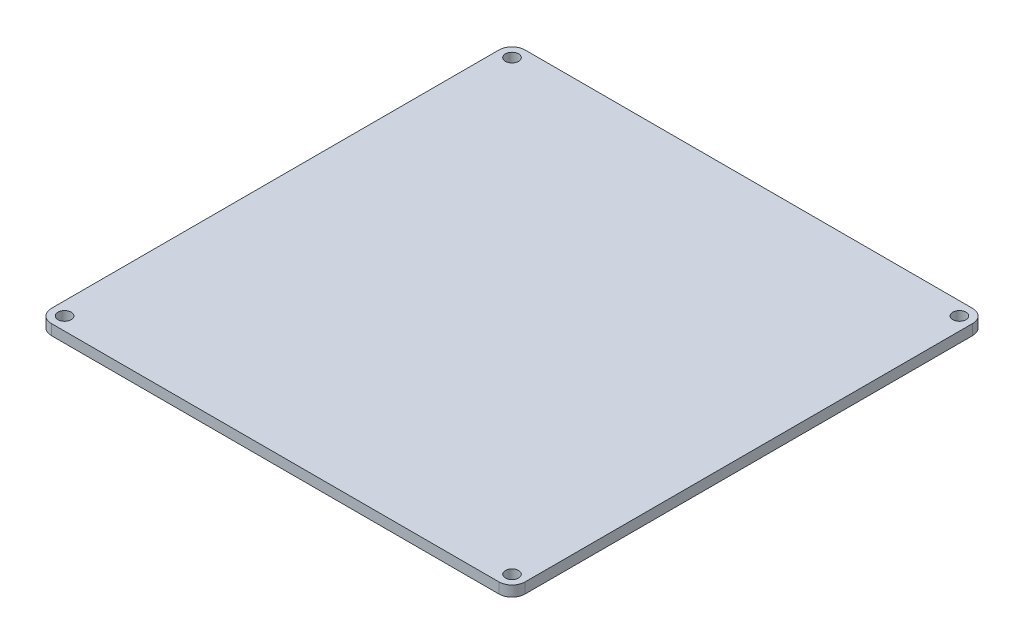
ISO-10303-21;
HEADER;
FILE_DESCRIPTION(('STEP AP214'),'2;1');
FILE_NAME('part.step','',(''),(''),'','','');
FILE_SCHEMA(('AUTOMOTIVE_DESIGN { 1 0 10303 214 1 1 1 1 }'));
ENDSEC;
DATA;
#1=APPLICATION_CONTEXT('core data for automotive mechanical design processes');
#2=APPLICATION_PROTOCOL_DEFINITION('international standard','automotive_design',2000,#1);
#3=PRODUCT_CONTEXT('',#1,'mechanical');
#4=PRODUCT('Part','Part','',(#3));
#5=PRODUCT_RELATED_PRODUCT_CATEGORY('part','',(#4));
#6=PRODUCT_DEFINITION_FORMATION('','',#4);
#7=PRODUCT_DEFINITION_CONTEXT('part definition',#1,'design');
#8=PRODUCT_DEFINITION('design','',#6,#7);
#9=PRODUCT_DEFINITION_SHAPE('','',#8);
#10=(LENGTH_UNIT() NAMED_UNIT(*) SI_UNIT(.MILLI.,.METRE.));
#11=(NAMED_UNIT(*) PLANE_ANGLE_UNIT() SI_UNIT($,.RADIAN.));
#12=(NAMED_UNIT(*) SI_UNIT($,.STERADIAN.) SOLID_ANGLE_UNIT());
#13=UNCERTAINTY_MEASURE_WITH_UNIT(LENGTH_MEASURE(1.E-05),#10,'distance_accuracy_value','');
#14=(GEOMETRIC_REPRESENTATION_CONTEXT(3) GLOBAL_UNCERTAINTY_ASSIGNED_CONTEXT((#13)) GLOBAL_UNIT_ASSIGNED_CONTEXT((#10,
#11,#12)) REPRESENTATION_CONTEXT('',''));
#15=CARTESIAN_POINT('',(0.,0.,0.));
#16=DIRECTION('',(0.,0.,1.));
#17=DIRECTION('',(1.,0.,0.));
#18=AXIS2_PLACEMENT_3D('',#15,#16,#17);
#19=CARTESIAN_POINT('',(0.,4.,0.));
#20=DIRECTION('',(0.,-1.,0.));
#21=DIRECTION('',(0.,0.,-1.));
#22=AXIS2_PLACEMENT_3D('',#19,#20,#21);
#23=PLANE('',#22);
#24=DIRECTION('',(-1.,0.,0.));
#25=VECTOR('',#24,1.);
#26=CARTESIAN_POINT('',(0.,4.,-180.));
#27=LINE('',#26,#25);
#28=CARTESIAN_POINT('',(175.,4.,-180.));
#29=VERTEX_POINT('',#28);
#30=CARTESIAN_POINT('',(5.,4.,-180.));
#31=VERTEX_POINT('',#30);
#32=EDGE_CURVE('E136',#29,#31,#27,.T.);
#33=ORIENTED_EDGE('',*,*,#32,.T.);
#34=CARTESIAN_POINT('',(5.,4.,-175.));
#35=DIRECTION('',(0.,-1.,0.));
#36=DIRECTION('',(0.,0.,-1.));
#37=AXIS2_PLACEMENT_3D('',#34,#35,#36);
#38=CIRCLE('',#37,5.);
#39=CARTESIAN_POINT('',(0.,4.,-175.));
#40=VERTEX_POINT('',#39);
#41=EDGE_CURVE('E155',#31,#40,#38,.F.);
#42=ORIENTED_EDGE('',*,*,#41,.T.);
#43=DIRECTION('',(0.,0.,1.));
#44=VECTOR('',#43,1.);
#45=CARTESIAN_POINT('',(0.,4.,0.));
#46=LINE('',#45,#44);
#47=CARTESIAN_POINT('',(0.,4.,-5.));
#48=VERTEX_POINT('',#47);
#49=EDGE_CURVE('E119',#40,#48,#46,.T.);
#50=ORIENTED_EDGE('',*,*,#49,.T.);
#51=CARTESIAN_POINT('',(5.,4.,-5.));
#52=DIRECTION('',(0.,-1.,0.));
#53=DIRECTION('',(0.,0.,-1.));
#54=AXIS2_PLACEMENT_3D('',#51,#52,#53);
#55=CIRCLE('',#54,5.);
#56=CARTESIAN_POINT('',(5.,4.,0.));
#57=VERTEX_POINT('',#56);
#58=EDGE_CURVE('E150',#48,#57,#55,.F.);
#59=ORIENTED_EDGE('',*,*,#58,.T.);
#60=DIRECTION('',(1.,0.,0.));
#61=VECTOR('',#60,1.);
#62=CARTESIAN_POINT('',(0.,4.,0.));
#63=LINE('',#62,#61);
#64=CARTESIAN_POINT('',(175.,4.,0.));
#65=VERTEX_POINT('',#64);
#66=EDGE_CURVE('E166',#57,#65,#63,.T.);
#67=ORIENTED_EDGE('',*,*,#66,.T.);
#68=CARTESIAN_POINT('',(175.,4.,-5.));
#69=DIRECTION('',(0.,-1.,0.));
#70=DIRECTION('',(0.,0.,-1.));
#71=AXIS2_PLACEMENT_3D('',#68,#69,#70);
#72=CIRCLE('',#71,5.);
#73=CARTESIAN_POINT('',(180.,4.,-5.));
#74=VERTEX_POINT('',#73);
#75=EDGE_CURVE('E55',#65,#74,#72,.F.);
#76=ORIENTED_EDGE('',*,*,#75,.T.);
#77=DIRECTION('',(0.,0.,-1.));
#78=VECTOR('',#77,1.);
#79=CARTESIAN_POINT('',(180.,4.,0.));
#80=LINE('',#79,#78);
#81=CARTESIAN_POINT('',(180.,4.,-175.));
#82=VERTEX_POINT('',#81);
#83=EDGE_CURVE('E174',#74,#82,#80,.T.);
#84=ORIENTED_EDGE('',*,*,#83,.T.);
#85=CARTESIAN_POINT('',(175.,4.,-175.));
#86=DIRECTION('',(0.,-1.,0.));
#87=DIRECTION('',(0.,0.,-1.));
#88=AXIS2_PLACEMENT_3D('',#85,#86,#87);
#89=CIRCLE('',#88,5.);
#90=EDGE_CURVE('E153',#82,#29,#89,.F.);
#91=ORIENTED_EDGE('',*,*,#90,.T.);
#92=EDGE_LOOP('',(#33,#42,#50,#59,#67,#76,#84,#91));
#93=FACE_BOUND('',#92,.T.);
#94=CARTESIAN_POINT('',(4.99999999999999,4.,-175.));
#95=DIRECTION('',(0.,1.,0.));
#96=DIRECTION('',(0.,0.,1.));
#97=AXIS2_PLACEMENT_3D('',#94,#95,#96);
#98=CIRCLE('',#97,2.5);
#99=CARTESIAN_POINT('',(4.99999999999999,4.,-172.5));
#100=VERTEX_POINT('',#99);
#101=EDGE_CURVE('E127',#100,#100,#98,.T.);
#102=ORIENTED_EDGE('',*,*,#101,.F.);
#103=EDGE_LOOP('',(#102));
#104=FACE_BOUND('',#103,.T.);
#105=CARTESIAN_POINT('',(175.,4.,-4.99999999999999));
#106=DIRECTION('',(0.,1.,0.));
#107=DIRECTION('',(0.,0.,1.));
#108=AXIS2_PLACEMENT_3D('',#105,#106,#107);
#109=CIRCLE('',#108,2.5);
#110=CARTESIAN_POINT('',(175.,4.,-2.5));
#111=VERTEX_POINT('',#110);
#112=EDGE_CURVE('E181',#111,#111,#109,.T.);
#113=ORIENTED_EDGE('',*,*,#112,.F.);
#114=EDGE_LOOP('',(#113));
#115=FACE_BOUND('',#114,.T.);
#116=CARTESIAN_POINT('',(175.,4.,-175.));
#117=DIRECTION('',(0.,1.,0.));
#118=DIRECTION('',(0.,0.,1.));
#119=AXIS2_PLACEMENT_3D('',#116,#117,#118);
#120=CIRCLE('',#119,2.5);
#121=CARTESIAN_POINT('',(175.,4.,-172.5));
#122=VERTEX_POINT('',#121);
#123=EDGE_CURVE('E186',#122,#122,#120,.T.);
#124=ORIENTED_EDGE('',*,*,#123,.F.);
#125=EDGE_LOOP('',(#124));
#126=FACE_BOUND('',#125,.T.);
#127=CARTESIAN_POINT('',(4.99999999999999,4.,-4.99999999999999));
#128=DIRECTION('',(0.,1.,0.));
#129=DIRECTION('',(0.,0.,1.));
#130=AXIS2_PLACEMENT_3D('',#127,#128,#129);
#131=CIRCLE('',#130,2.5);
#132=CARTESIAN_POINT('',(4.99999999999999,4.,-2.49999999999999));
#133=VERTEX_POINT('',#132);
#134=EDGE_CURVE('E192',#133,#133,#131,.T.);
#135=ORIENTED_EDGE('',*,*,#134,.F.);
#136=EDGE_LOOP('',(#135));
#137=FACE_BOUND('',#136,.T.);
#138=ADVANCED_FACE('F33',(#93,#104,#115,#126,#137),#23,.F.);
#139=CARTESIAN_POINT('',(0.,0.,0.));
#140=DIRECTION('',(0.,-1.,0.));
#141=DIRECTION('',(0.,0.,-1.));
#142=AXIS2_PLACEMENT_3D('',#139,#140,#141);
#143=PLANE('',#142);
#144=CARTESIAN_POINT('',(175.,0.,-175.));
#145=DIRECTION('',(0.,1.,0.));
#146=DIRECTION('',(0.,0.,1.));
#147=AXIS2_PLACEMENT_3D('',#144,#145,#146);
#148=CIRCLE('',#147,2.5);
#149=CARTESIAN_POINT('',(175.,0.,-172.5));
#150=VERTEX_POINT('',#149);
#151=EDGE_CURVE('E189',#150,#150,#148,.T.);
#152=ORIENTED_EDGE('',*,*,#151,.T.);
#153=EDGE_LOOP('',(#152));
#154=FACE_BOUND('',#153,.T.);
#155=CARTESIAN_POINT('',(4.99999999999999,0.,-175.));
#156=DIRECTION('',(0.,1.,0.));
#157=DIRECTION('',(0.,0.,1.));
#158=AXIS2_PLACEMENT_3D('',#155,#156,#157);
#159=CIRCLE('',#158,2.5);
#160=CARTESIAN_POINT('',(4.99999999999999,0.,-172.5));
#161=VERTEX_POINT('',#160);
#162=EDGE_CURVE('E133',#161,#161,#159,.T.);
#163=ORIENTED_EDGE('',*,*,#162,.T.);
#164=EDGE_LOOP('',(#163));
#165=FACE_BOUND('',#164,.T.);
#166=DIRECTION('',(0.,0.,1.));
#167=VECTOR('',#166,1.);
#168=CARTESIAN_POINT('',(0.,0.,0.));
#169=LINE('',#168,#167);
#170=CARTESIAN_POINT('',(0.,0.,-175.));
#171=VERTEX_POINT('',#170);
#172=CARTESIAN_POINT('',(0.,0.,-5.));
#173=VERTEX_POINT('',#172);
#174=EDGE_CURVE('E116',#171,#173,#169,.T.);
#175=ORIENTED_EDGE('',*,*,#174,.F.);
#176=CARTESIAN_POINT('',(5.,0.,-175.));
#177=DIRECTION('',(0.,-1.,0.));
#178=DIRECTION('',(0.,0.,-1.));
#179=AXIS2_PLACEMENT_3D('',#176,#177,#178);
#180=CIRCLE('',#179,5.);
#181=CARTESIAN_POINT('',(5.,0.,-180.));
#182=VERTEX_POINT('',#181);
#183=EDGE_CURVE('E99',#171,#182,#180,.T.);
#184=ORIENTED_EDGE('',*,*,#183,.T.);
#185=DIRECTION('',(-1.,0.,0.));
#186=VECTOR('',#185,1.);
#187=CARTESIAN_POINT('',(0.,0.,-180.));
#188=LINE('',#187,#186);
#189=CARTESIAN_POINT('',(175.,0.,-180.));
#190=VERTEX_POINT('',#189);
#191=EDGE_CURVE('E140',#190,#182,#188,.T.);
#192=ORIENTED_EDGE('',*,*,#191,.F.);
#193=CARTESIAN_POINT('',(175.,0.,-175.));
#194=DIRECTION('',(0.,-1.,0.));
#195=DIRECTION('',(0.,0.,-1.));
#196=AXIS2_PLACEMENT_3D('',#193,#194,#195);
#197=CIRCLE('',#196,5.);
#198=CARTESIAN_POINT('',(180.,0.,-175.));
#199=VERTEX_POINT('',#198);
#200=EDGE_CURVE('E110',#190,#199,#197,.T.);
#201=ORIENTED_EDGE('',*,*,#200,.T.);
#202=DIRECTION('',(0.,0.,-1.));
#203=VECTOR('',#202,1.);
#204=CARTESIAN_POINT('',(180.,0.,0.));
#205=LINE('',#204,#203);
#206=CARTESIAN_POINT('',(180.,0.,-5.));
#207=VERTEX_POINT('',#206);
#208=EDGE_CURVE('E130',#207,#199,#205,.T.);
#209=ORIENTED_EDGE('',*,*,#208,.F.);
#210=CARTESIAN_POINT('',(175.,0.,-5.));
#211=DIRECTION('',(0.,-1.,0.));
#212=DIRECTION('',(0.,0.,-1.));
#213=AXIS2_PLACEMENT_3D('',#210,#211,#212);
#214=CIRCLE('',#213,5.);
#215=CARTESIAN_POINT('',(175.,0.,0.));
#216=VERTEX_POINT('',#215);
#217=EDGE_CURVE('E144',#207,#216,#214,.T.);
#218=ORIENTED_EDGE('',*,*,#217,.T.);
#219=DIRECTION('',(1.,0.,0.));
#220=VECTOR('',#219,1.);
#221=CARTESIAN_POINT('',(0.,0.,0.));
#222=LINE('',#221,#220);
#223=CARTESIAN_POINT('',(5.,0.,0.));
#224=VERTEX_POINT('',#223);
#225=EDGE_CURVE('E126',#224,#216,#222,.T.);
#226=ORIENTED_EDGE('',*,*,#225,.F.);
#227=CARTESIAN_POINT('',(5.,0.,-5.));
#228=DIRECTION('',(0.,-1.,0.));
#229=DIRECTION('',(0.,0.,-1.));
#230=AXIS2_PLACEMENT_3D('',#227,#228,#229);
#231=CIRCLE('',#230,5.);
#232=EDGE_CURVE('E120',#224,#173,#231,.T.);
#233=ORIENTED_EDGE('',*,*,#232,.T.);
#234=EDGE_LOOP('',(#175,#184,#192,#201,#209,#218,#226,#233));
#235=FACE_BOUND('',#234,.T.);
#236=CARTESIAN_POINT('',(175.,0.,-4.99999999999999));
#237=DIRECTION('',(0.,1.,0.));
#238=DIRECTION('',(0.,0.,1.));
#239=AXIS2_PLACEMENT_3D('',#236,#237,#238);
#240=CIRCLE('',#239,2.5);
#241=CARTESIAN_POINT('',(175.,0.,-2.5));
#242=VERTEX_POINT('',#241);
#243=EDGE_CURVE('E183',#242,#242,#240,.T.);
#244=ORIENTED_EDGE('',*,*,#243,.T.);
#245=EDGE_LOOP('',(#244));
#246=FACE_BOUND('',#245,.T.);
#247=CARTESIAN_POINT('',(4.99999999999999,0.,-4.99999999999999));
#248=DIRECTION('',(0.,1.,0.));
#249=DIRECTION('',(0.,0.,1.));
#250=AXIS2_PLACEMENT_3D('',#247,#248,#249);
#251=CIRCLE('',#250,2.5);
#252=CARTESIAN_POINT('',(4.99999999999999,0.,-2.49999999999999));
#253=VERTEX_POINT('',#252);
#254=EDGE_CURVE('E195',#253,#253,#251,.T.);
#255=ORIENTED_EDGE('',*,*,#254,.T.);
#256=EDGE_LOOP('',(#255));
#257=FACE_BOUND('',#256,.T.);
#258=ADVANCED_FACE('F123',(#154,#165,#235,#246,#257),#143,.T.);
#259=CARTESIAN_POINT('',(0.,4.,0.));
#260=DIRECTION('',(1.,0.,0.));
#261=DIRECTION('',(0.,0.,-1.));
#262=AXIS2_PLACEMENT_3D('',#259,#260,#261);
#263=PLANE('',#262);
#264=ORIENTED_EDGE('',*,*,#49,.F.);
#265=DIRECTION('',(0.,-1.,0.));
#266=VECTOR('',#265,1.);
#267=CARTESIAN_POINT('',(0.,4.,-175.));
#268=LINE('',#267,#266);
#269=EDGE_CURVE('E103',#40,#171,#268,.T.);
#270=ORIENTED_EDGE('',*,*,#269,.T.);
#271=ORIENTED_EDGE('',*,*,#174,.T.);
#272=DIRECTION('',(0.,-1.,0.));
#273=VECTOR('',#272,1.);
#274=CARTESIAN_POINT('',(0.,4.,-5.));
#275=LINE('',#274,#273);
#276=EDGE_CURVE('E121',#173,#48,#275,.F.);
#277=ORIENTED_EDGE('',*,*,#276,.T.);
#278=EDGE_LOOP('',(#264,#270,#271,#277));
#279=FACE_BOUND('',#278,.T.);
#280=ADVANCED_FACE('F115',(#279),#263,.F.);
#281=CARTESIAN_POINT('',(0.,4.,0.));
#282=DIRECTION('',(0.,0.,-1.));
#283=DIRECTION('',(-1.,0.,0.));
#284=AXIS2_PLACEMENT_3D('',#281,#282,#283);
#285=PLANE('',#284);
#286=ORIENTED_EDGE('',*,*,#225,.T.);
#287=DIRECTION('',(0.,-1.,0.));
#288=VECTOR('',#287,1.);
#289=CARTESIAN_POINT('',(175.,4.,0.));
#290=LINE('',#289,#288);
#291=EDGE_CURVE('E11',#216,#65,#290,.F.);
#292=ORIENTED_EDGE('',*,*,#291,.T.);
#293=ORIENTED_EDGE('',*,*,#66,.F.);
#294=DIRECTION('',(0.,-1.,0.));
#295=VECTOR('',#294,1.);
#296=CARTESIAN_POINT('',(5.,4.,0.));
#297=LINE('',#296,#295);
#298=EDGE_CURVE('E41',#57,#224,#297,.T.);
#299=ORIENTED_EDGE('',*,*,#298,.T.);
#300=EDGE_LOOP('',(#286,#292,#293,#299));
#301=FACE_BOUND('',#300,.T.);
#302=ADVANCED_FACE('F164',(#301),#285,.F.);
#303=CARTESIAN_POINT('',(180.,4.,0.));
#304=DIRECTION('',(-1.,0.,0.));
#305=DIRECTION('',(0.,0.,1.));
#306=AXIS2_PLACEMENT_3D('',#303,#304,#305);
#307=PLANE('',#306);
#308=ORIENTED_EDGE('',*,*,#208,.T.);
#309=DIRECTION('',(0.,-1.,0.));
#310=VECTOR('',#309,1.);
#311=CARTESIAN_POINT('',(180.,4.,-175.));
#312=LINE('',#311,#310);
#313=EDGE_CURVE('E48',#199,#82,#312,.F.);
#314=ORIENTED_EDGE('',*,*,#313,.T.);
#315=ORIENTED_EDGE('',*,*,#83,.F.);
#316=DIRECTION('',(0.,-1.,0.));
#317=VECTOR('',#316,1.);
#318=CARTESIAN_POINT('',(180.,4.,-5.));
#319=LINE('',#318,#317);
#320=EDGE_CURVE('E157',#74,#207,#319,.T.);
#321=ORIENTED_EDGE('',*,*,#320,.T.);
#322=EDGE_LOOP('',(#308,#314,#315,#321));
#323=FACE_BOUND('',#322,.T.);
#324=ADVANCED_FACE('F173',(#323),#307,.F.);
#325=CARTESIAN_POINT('',(0.,4.,-180.));
#326=DIRECTION('',(0.,0.,1.));
#327=DIRECTION('',(1.,0.,0.));
#328=AXIS2_PLACEMENT_3D('',#325,#326,#327);
#329=PLANE('',#328);
#330=ORIENTED_EDGE('',*,*,#191,.T.);
#331=DIRECTION('',(0.,-1.,0.));
#332=VECTOR('',#331,1.);
#333=CARTESIAN_POINT('',(5.,4.,-180.));
#334=LINE('',#333,#332);
#335=EDGE_CURVE('E104',#182,#31,#334,.F.);
#336=ORIENTED_EDGE('',*,*,#335,.T.);
#337=ORIENTED_EDGE('',*,*,#32,.F.);
#338=DIRECTION('',(0.,-1.,0.));
#339=VECTOR('',#338,1.);
#340=CARTESIAN_POINT('',(175.,4.,-180.));
#341=LINE('',#340,#339);
#342=EDGE_CURVE('E109',#29,#190,#341,.T.);
#343=ORIENTED_EDGE('',*,*,#342,.T.);
#344=EDGE_LOOP('',(#330,#336,#337,#343));
#345=FACE_BOUND('',#344,.T.);
#346=ADVANCED_FACE('F216',(#345),#329,.F.);
#347=CARTESIAN_POINT('',(4.99999999999999,4.,-175.));
#348=DIRECTION('',(0.,-1.,0.));
#349=DIRECTION('',(0.,0.,-1.));
#350=AXIS2_PLACEMENT_3D('',#347,#348,#349);
#351=CYLINDRICAL_SURFACE('',#350,2.5);
#352=ORIENTED_EDGE('',*,*,#101,.T.);
#353=EDGE_LOOP('',(#352));
#354=FACE_BOUND('',#353,.T.);
#355=ORIENTED_EDGE('',*,*,#162,.F.);
#356=EDGE_LOOP('',(#355));
#357=FACE_BOUND('',#356,.T.);
#358=ADVANCED_FACE('F213',(#354,#357),#351,.F.);
#359=CARTESIAN_POINT('',(175.,4.,-4.99999999999999));
#360=DIRECTION('',(0.,-1.,0.));
#361=DIRECTION('',(0.,0.,-1.));
#362=AXIS2_PLACEMENT_3D('',#359,#360,#361);
#363=CYLINDRICAL_SURFACE('',#362,2.5);
#364=ORIENTED_EDGE('',*,*,#112,.T.);
#365=EDGE_LOOP('',(#364));
#366=FACE_BOUND('',#365,.T.);
#367=ORIENTED_EDGE('',*,*,#243,.F.);
#368=EDGE_LOOP('',(#367));
#369=FACE_BOUND('',#368,.T.);
#370=ADVANCED_FACE('F309',(#366,#369),#363,.F.);
#371=CARTESIAN_POINT('',(175.,4.,-175.));
#372=DIRECTION('',(0.,-1.,0.));
#373=DIRECTION('',(0.,0.,-1.));
#374=AXIS2_PLACEMENT_3D('',#371,#372,#373);
#375=CYLINDRICAL_SURFACE('',#374,2.5);
#376=ORIENTED_EDGE('',*,*,#123,.T.);
#377=EDGE_LOOP('',(#376));
#378=FACE_BOUND('',#377,.T.);
#379=ORIENTED_EDGE('',*,*,#151,.F.);
#380=EDGE_LOOP('',(#379));
#381=FACE_BOUND('',#380,.T.);
#382=ADVANCED_FACE('F300',(#378,#381),#375,.F.);
#383=CARTESIAN_POINT('',(4.99999999999999,4.,-4.99999999999999));
#384=DIRECTION('',(0.,-1.,0.));
#385=DIRECTION('',(0.,0.,-1.));
#386=AXIS2_PLACEMENT_3D('',#383,#384,#385);
#387=CYLINDRICAL_SURFACE('',#386,2.5);
#388=ORIENTED_EDGE('',*,*,#134,.T.);
#389=EDGE_LOOP('',(#388));
#390=FACE_BOUND('',#389,.T.);
#391=ORIENTED_EDGE('',*,*,#254,.F.);
#392=EDGE_LOOP('',(#391));
#393=FACE_BOUND('',#392,.T.);
#394=ADVANCED_FACE('F201',(#390,#393),#387,.F.);
#395=CARTESIAN_POINT('',(5.,4.,-175.));
#396=DIRECTION('',(0.,-1.,0.));
#397=DIRECTION('',(0.,0.,-1.));
#398=AXIS2_PLACEMENT_3D('',#395,#396,#397);
#399=CYLINDRICAL_SURFACE('',#398,5.);
#400=ORIENTED_EDGE('',*,*,#41,.F.);
#401=ORIENTED_EDGE('',*,*,#335,.F.);
#402=ORIENTED_EDGE('',*,*,#183,.F.);
#403=ORIENTED_EDGE('',*,*,#269,.F.);
#404=EDGE_LOOP('',(#400,#401,#402,#403));
#405=FACE_BOUND('',#404,.T.);
#406=ADVANCED_FACE('F102',(#405),#399,.T.);
#407=CARTESIAN_POINT('',(175.,4.,-175.));
#408=DIRECTION('',(0.,-1.,0.));
#409=DIRECTION('',(0.,0.,-1.));
#410=AXIS2_PLACEMENT_3D('',#407,#408,#409);
#411=CYLINDRICAL_SURFACE('',#410,5.);
#412=ORIENTED_EDGE('',*,*,#90,.F.);
#413=ORIENTED_EDGE('',*,*,#313,.F.);
#414=ORIENTED_EDGE('',*,*,#200,.F.);
#415=ORIENTED_EDGE('',*,*,#342,.F.);
#416=EDGE_LOOP('',(#412,#413,#414,#415));
#417=FACE_BOUND('',#416,.T.);
#418=ADVANCED_FACE('F228',(#417),#411,.T.);
#419=CARTESIAN_POINT('',(175.,4.,-5.));
#420=DIRECTION('',(0.,-1.,0.));
#421=DIRECTION('',(0.,0.,-1.));
#422=AXIS2_PLACEMENT_3D('',#419,#420,#421);
#423=CYLINDRICAL_SURFACE('',#422,5.);
#424=ORIENTED_EDGE('',*,*,#75,.F.);
#425=ORIENTED_EDGE('',*,*,#291,.F.);
#426=ORIENTED_EDGE('',*,*,#217,.F.);
#427=ORIENTED_EDGE('',*,*,#320,.F.);
#428=EDGE_LOOP('',(#424,#425,#426,#427));
#429=FACE_BOUND('',#428,.T.);
#430=ADVANCED_FACE('F172',(#429),#423,.T.);
#431=CARTESIAN_POINT('',(5.,4.,-5.));
#432=DIRECTION('',(0.,-1.,0.));
#433=DIRECTION('',(0.,0.,-1.));
#434=AXIS2_PLACEMENT_3D('',#431,#432,#433);
#435=CYLINDRICAL_SURFACE('',#434,5.);
#436=ORIENTED_EDGE('',*,*,#58,.F.);
#437=ORIENTED_EDGE('',*,*,#276,.F.);
#438=ORIENTED_EDGE('',*,*,#232,.F.);
#439=ORIENTED_EDGE('',*,*,#298,.F.);
#440=EDGE_LOOP('',(#436,#437,#438,#439));
#441=FACE_BOUND('',#440,.T.);
#442=ADVANCED_FACE('F35',(#441),#435,.T.);
#443=CLOSED_SHELL('',(#138,#258,#280,#302,#324,#346,#358,#370,#382,#394,#406,#418,#430,#442));
#444=MANIFOLD_SOLID_BREP('B2',#443);
#445=ADVANCED_BREP_SHAPE_REPRESENTATION('',(#18,#444),#14);
#446=SHAPE_DEFINITION_REPRESENTATION(#9,#445);
ENDSEC;
END-ISO-10303-21;
